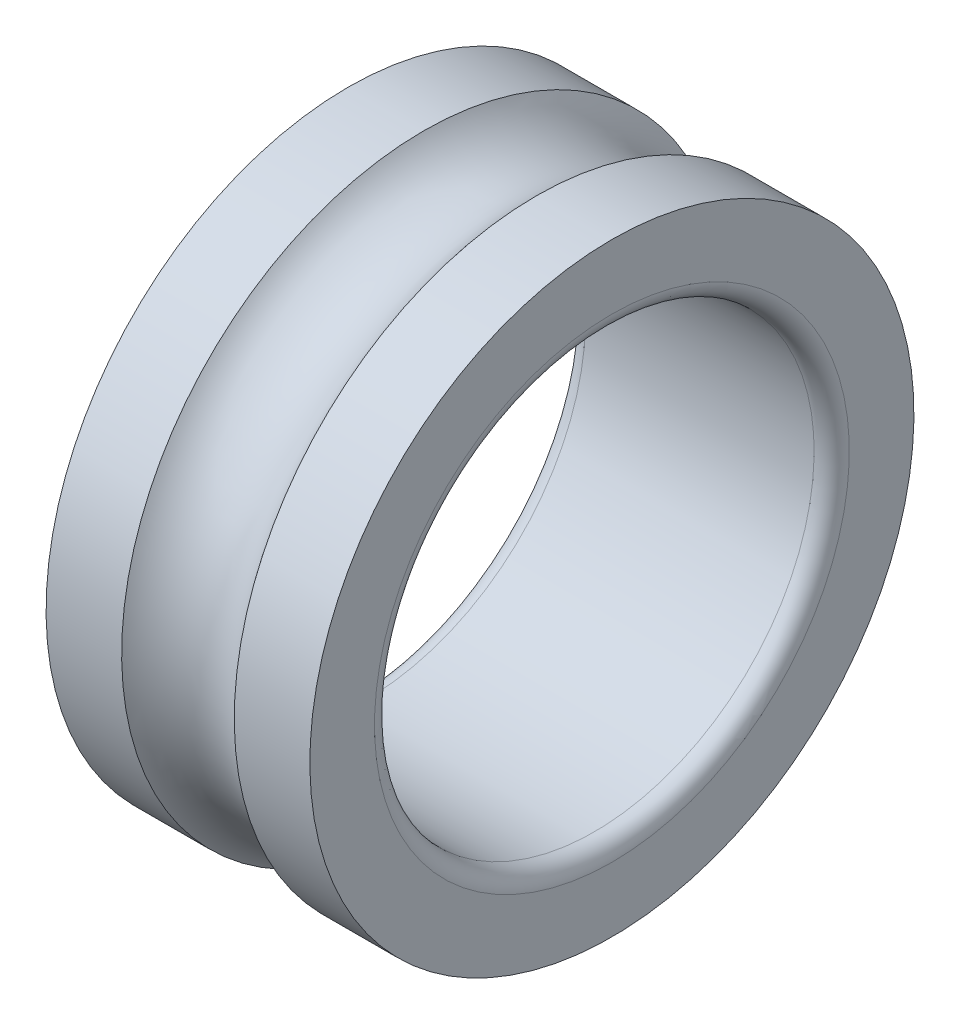
ISO-10303-21;
HEADER;
FILE_DESCRIPTION(('STEP AP214'),'2;1');
FILE_NAME('part.step','',(''),(''),'','','');
FILE_SCHEMA(('AUTOMOTIVE_DESIGN { 1 0 10303 214 1 1 1 1 }'));
ENDSEC;
DATA;
#1=APPLICATION_CONTEXT('core data for automotive mechanical design processes');
#2=APPLICATION_PROTOCOL_DEFINITION('international standard','automotive_design',2000,#1);
#3=PRODUCT_CONTEXT('',#1,'mechanical');
#4=PRODUCT('Part','Part','',(#3));
#5=PRODUCT_RELATED_PRODUCT_CATEGORY('part','',(#4));
#6=PRODUCT_DEFINITION_FORMATION('','',#4);
#7=PRODUCT_DEFINITION_CONTEXT('part definition',#1,'design');
#8=PRODUCT_DEFINITION('design','',#6,#7);
#9=PRODUCT_DEFINITION_SHAPE('','',#8);
#10=(LENGTH_UNIT() NAMED_UNIT(*) SI_UNIT(.MILLI.,.METRE.));
#11=(NAMED_UNIT(*) PLANE_ANGLE_UNIT() SI_UNIT($,.RADIAN.));
#12=(NAMED_UNIT(*) SI_UNIT($,.STERADIAN.) SOLID_ANGLE_UNIT());
#13=UNCERTAINTY_MEASURE_WITH_UNIT(LENGTH_MEASURE(1.E-05),#10,'distance_accuracy_value','');
#14=(GEOMETRIC_REPRESENTATION_CONTEXT(3) GLOBAL_UNCERTAINTY_ASSIGNED_CONTEXT((#13)) GLOBAL_UNIT_ASSIGNED_CONTEXT((#10,
#11,#12)) REPRESENTATION_CONTEXT('',''));
#15=CARTESIAN_POINT('',(0.,0.,0.));
#16=DIRECTION('',(0.,0.,1.));
#17=DIRECTION('',(1.,0.,0.));
#18=AXIS2_PLACEMENT_3D('',#15,#16,#17);
#19=CARTESIAN_POINT('',(12.8510883798217,0.,0.));
#20=DIRECTION('',(-1.,0.,0.));
#21=DIRECTION('',(0.,1.,0.));
#22=AXIS2_PLACEMENT_3D('',#19,#20,#21);
#23=CYLINDRICAL_SURFACE('',#22,17.175);
#24=CARTESIAN_POINT('',(10.7021767596434,0.,0.));
#25=DIRECTION('',(1.,0.,0.));
#26=DIRECTION('',(0.,1.,0.));
#27=AXIS2_PLACEMENT_3D('',#24,#25,#26);
#28=CIRCLE('',#27,17.175);
#29=CARTESIAN_POINT('',(10.7021767596434,17.175,0.));
#30=VERTEX_POINT('',#29);
#31=EDGE_CURVE('E11',#30,#30,#28,.T.);
#32=ORIENTED_EDGE('',*,*,#31,.T.);
#33=EDGE_LOOP('',(#32));
#34=FACE_BOUND('',#33,.T.);
#35=CARTESIAN_POINT('',(15.,0.,0.));
#36=DIRECTION('',(1.,0.,0.));
#37=DIRECTION('',(0.,1.,0.));
#38=AXIS2_PLACEMENT_3D('',#35,#36,#37);
#39=CIRCLE('',#38,17.175);
#40=CARTESIAN_POINT('',(15.,17.175,0.));
#41=VERTEX_POINT('',#40);
#42=EDGE_CURVE('E52',#41,#41,#39,.T.);
#43=ORIENTED_EDGE('',*,*,#42,.F.);
#44=EDGE_LOOP('',(#43));
#45=FACE_BOUND('',#44,.T.);
#46=ADVANCED_FACE('F16',(#34,#45),#23,.T.);
#47=CARTESIAN_POINT('',(7.5,0.,0.));
#48=DIRECTION('',(1.,0.,0.));
#49=DIRECTION('',(0.,0.,-1.));
#50=AXIS2_PLACEMENT_3D('',#47,#48,#49);
#51=TOROIDAL_SURFACE('',#50,19.52,3.969);
#52=CARTESIAN_POINT('',(4.29782324035664,0.,0.));
#53=DIRECTION('',(1.,0.,0.));
#54=DIRECTION('',(0.,1.,0.));
#55=AXIS2_PLACEMENT_3D('',#52,#53,#54);
#56=CIRCLE('',#55,17.175);
#57=CARTESIAN_POINT('',(4.29782324035664,17.175,0.));
#58=VERTEX_POINT('',#57);
#59=EDGE_CURVE('E26',#58,#58,#56,.T.);
#60=ORIENTED_EDGE('',*,*,#59,.T.);
#61=EDGE_LOOP('',(#60));
#62=FACE_BOUND('',#61,.T.);
#63=ORIENTED_EDGE('',*,*,#31,.F.);
#64=EDGE_LOOP('',(#63));
#65=FACE_BOUND('',#64,.T.);
#66=ADVANCED_FACE('F87',(#62,#65),#51,.F.);
#67=CARTESIAN_POINT('',(2.14891162017832,0.,0.));
#68=DIRECTION('',(-1.,0.,0.));
#69=DIRECTION('',(0.,1.,0.));
#70=AXIS2_PLACEMENT_3D('',#67,#68,#69);
#71=CYLINDRICAL_SURFACE('',#70,17.175);
#72=CARTESIAN_POINT('',(0.,0.,0.));
#73=DIRECTION('',(1.,0.,0.));
#74=DIRECTION('',(0.,1.,0.));
#75=AXIS2_PLACEMENT_3D('',#72,#73,#74);
#76=CIRCLE('',#75,17.175);
#77=CARTESIAN_POINT('',(0.,17.175,0.));
#78=VERTEX_POINT('',#77);
#79=EDGE_CURVE('E60',#78,#78,#76,.T.);
#80=ORIENTED_EDGE('',*,*,#79,.T.);
#81=EDGE_LOOP('',(#80));
#82=FACE_BOUND('',#81,.T.);
#83=ORIENTED_EDGE('',*,*,#59,.F.);
#84=EDGE_LOOP('',(#83));
#85=FACE_BOUND('',#84,.T.);
#86=ADVANCED_FACE('F82',(#82,#85),#71,.T.);
#87=CARTESIAN_POINT('',(0.,15.3375,0.));
#88=DIRECTION('',(-1.,0.,0.));
#89=DIRECTION('',(0.,-1.,0.));
#90=AXIS2_PLACEMENT_3D('',#87,#88,#89);
#91=PLANE('',#90);
#92=CARTESIAN_POINT('',(0.,0.,0.));
#93=DIRECTION('',(1.,0.,0.));
#94=DIRECTION('',(0.,1.,0.));
#95=AXIS2_PLACEMENT_3D('',#92,#93,#94);
#96=CIRCLE('',#95,13.5);
#97=CARTESIAN_POINT('',(0.,13.5,0.));
#98=VERTEX_POINT('',#97);
#99=EDGE_CURVE('E62',#98,#98,#96,.T.);
#100=ORIENTED_EDGE('',*,*,#99,.T.);
#101=EDGE_LOOP('',(#100));
#102=FACE_BOUND('',#101,.T.);
#103=ORIENTED_EDGE('',*,*,#79,.F.);
#104=EDGE_LOOP('',(#103));
#105=FACE_BOUND('',#104,.T.);
#106=ADVANCED_FACE('F68',(#102,#105),#91,.T.);
#107=CARTESIAN_POINT('',(1.,0.,0.));
#108=DIRECTION('',(1.,0.,0.));
#109=DIRECTION('',(0.,0.,-1.));
#110=AXIS2_PLACEMENT_3D('',#107,#108,#109);
#111=TOROIDAL_SURFACE('',#110,13.5,1.);
#112=CARTESIAN_POINT('',(1.,0.,0.));
#113=DIRECTION('',(1.,0.,0.));
#114=DIRECTION('',(0.,1.,0.));
#115=AXIS2_PLACEMENT_3D('',#112,#113,#114);
#116=CIRCLE('',#115,12.5);
#117=CARTESIAN_POINT('',(1.,12.5,0.));
#118=VERTEX_POINT('',#117);
#119=EDGE_CURVE('E57',#118,#118,#116,.T.);
#120=ORIENTED_EDGE('',*,*,#119,.T.);
#121=EDGE_LOOP('',(#120));
#122=FACE_BOUND('',#121,.T.);
#123=ORIENTED_EDGE('',*,*,#99,.F.);
#124=EDGE_LOOP('',(#123));
#125=FACE_BOUND('',#124,.T.);
#126=ADVANCED_FACE('F71',(#122,#125),#111,.T.);
#127=CARTESIAN_POINT('',(7.5,0.,0.));
#128=DIRECTION('',(-1.,0.,0.));
#129=DIRECTION('',(0.,1.,0.));
#130=AXIS2_PLACEMENT_3D('',#127,#128,#129);
#131=CYLINDRICAL_SURFACE('',#130,12.5);
#132=CARTESIAN_POINT('',(14.,0.,0.));
#133=DIRECTION('',(1.,0.,0.));
#134=DIRECTION('',(0.,1.,0.));
#135=AXIS2_PLACEMENT_3D('',#132,#133,#134);
#136=CIRCLE('',#135,12.5);
#137=CARTESIAN_POINT('',(14.,12.5,0.));
#138=VERTEX_POINT('',#137);
#139=EDGE_CURVE('E53',#138,#138,#136,.T.);
#140=ORIENTED_EDGE('',*,*,#139,.T.);
#141=EDGE_LOOP('',(#140));
#142=FACE_BOUND('',#141,.T.);
#143=ORIENTED_EDGE('',*,*,#119,.F.);
#144=EDGE_LOOP('',(#143));
#145=FACE_BOUND('',#144,.T.);
#146=ADVANCED_FACE('F73',(#142,#145),#131,.F.);
#147=CARTESIAN_POINT('',(14.,0.,0.));
#148=DIRECTION('',(1.,0.,0.));
#149=DIRECTION('',(0.,0.,-1.));
#150=AXIS2_PLACEMENT_3D('',#147,#148,#149);
#151=TOROIDAL_SURFACE('',#150,13.5,1.);
#152=CARTESIAN_POINT('',(15.,0.,0.));
#153=DIRECTION('',(1.,0.,0.));
#154=DIRECTION('',(0.,1.,0.));
#155=AXIS2_PLACEMENT_3D('',#152,#153,#154);
#156=CIRCLE('',#155,13.5);
#157=CARTESIAN_POINT('',(15.,13.5,0.));
#158=VERTEX_POINT('',#157);
#159=EDGE_CURVE('E20',#158,#158,#156,.T.);
#160=ORIENTED_EDGE('',*,*,#159,.T.);
#161=EDGE_LOOP('',(#160));
#162=FACE_BOUND('',#161,.T.);
#163=ORIENTED_EDGE('',*,*,#139,.F.);
#164=EDGE_LOOP('',(#163));
#165=FACE_BOUND('',#164,.T.);
#166=ADVANCED_FACE('F49',(#162,#165),#151,.T.);
#167=CARTESIAN_POINT('',(15.,15.3375,0.));
#168=DIRECTION('',(1.,0.,0.));
#169=DIRECTION('',(0.,1.,0.));
#170=AXIS2_PLACEMENT_3D('',#167,#168,#169);
#171=PLANE('',#170);
#172=ORIENTED_EDGE('',*,*,#42,.T.);
#173=EDGE_LOOP('',(#172));
#174=FACE_BOUND('',#173,.T.);
#175=ORIENTED_EDGE('',*,*,#159,.F.);
#176=EDGE_LOOP('',(#175));
#177=FACE_BOUND('',#176,.T.);
#178=ADVANCED_FACE('F18',(#174,#177),#171,.T.);
#179=CLOSED_SHELL('',(#46,#66,#86,#106,#126,#146,#166,#178));
#180=MANIFOLD_SOLID_BREP('B1',#179);
#181=ADVANCED_BREP_SHAPE_REPRESENTATION('',(#18,#180),#14);
#182=SHAPE_DEFINITION_REPRESENTATION(#9,#181);
ENDSEC;
END-ISO-10303-21;
